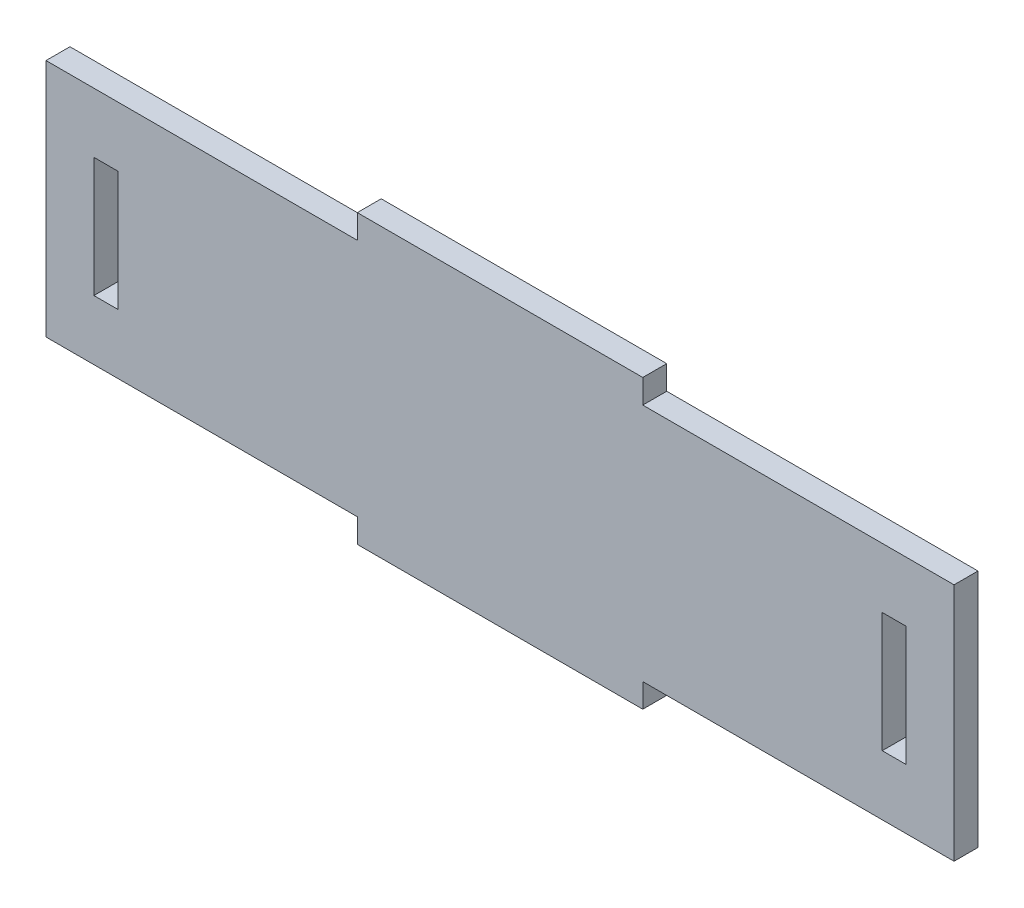
ISO-10303-21;
HEADER;
FILE_DESCRIPTION(('STEP AP214'),'2;1');
FILE_NAME('part.step','',(''),(''),'','','');
FILE_SCHEMA(('AUTOMOTIVE_DESIGN { 1 0 10303 214 1 1 1 1 }'));
ENDSEC;
DATA;
#1=APPLICATION_CONTEXT('core data for automotive mechanical design processes');
#2=APPLICATION_PROTOCOL_DEFINITION('international standard','automotive_design',2000,#1);
#3=PRODUCT_CONTEXT('',#1,'mechanical');
#4=PRODUCT('Part','Part','',(#3));
#5=PRODUCT_RELATED_PRODUCT_CATEGORY('part','',(#4));
#6=PRODUCT_DEFINITION_FORMATION('','',#4);
#7=PRODUCT_DEFINITION_CONTEXT('part definition',#1,'design');
#8=PRODUCT_DEFINITION('design','',#6,#7);
#9=PRODUCT_DEFINITION_SHAPE('','',#8);
#10=(LENGTH_UNIT() NAMED_UNIT(*) SI_UNIT(.MILLI.,.METRE.));
#11=(NAMED_UNIT(*) PLANE_ANGLE_UNIT() SI_UNIT($,.RADIAN.));
#12=(NAMED_UNIT(*) SI_UNIT($,.STERADIAN.) SOLID_ANGLE_UNIT());
#13=UNCERTAINTY_MEASURE_WITH_UNIT(LENGTH_MEASURE(1.E-05),#10,'distance_accuracy_value','');
#14=(GEOMETRIC_REPRESENTATION_CONTEXT(3) GLOBAL_UNCERTAINTY_ASSIGNED_CONTEXT((#13)) GLOBAL_UNIT_ASSIGNED_CONTEXT((#10,
#11,#12)) REPRESENTATION_CONTEXT('',''));
#15=CARTESIAN_POINT('',(0.,0.,0.));
#16=DIRECTION('',(0.,0.,1.));
#17=DIRECTION('',(1.,0.,0.));
#18=AXIS2_PLACEMENT_3D('',#15,#16,#17);
#19=CARTESIAN_POINT('',(0.,0.,2.));
#20=DIRECTION('',(0.,0.,-1.));
#21=DIRECTION('',(-1.,0.,0.));
#22=AXIS2_PLACEMENT_3D('',#19,#20,#21);
#23=PLANE('',#22);
#24=DIRECTION('',(0.,-1.,0.));
#25=VECTOR('',#24,1.);
#26=CARTESIAN_POINT('',(2.,15.,2.));
#27=LINE('',#26,#25);
#28=CARTESIAN_POINT('',(2.,15.,2.));
#29=VERTEX_POINT('',#28);
#30=CARTESIAN_POINT('',(2.,5.,2.));
#31=VERTEX_POINT('',#30);
#32=EDGE_CURVE('E225',#29,#31,#27,.T.);
#33=ORIENTED_EDGE('',*,*,#32,.F.);
#34=DIRECTION('',(-1.,0.,0.));
#35=VECTOR('',#34,1.);
#36=CARTESIAN_POINT('',(2.,15.,2.));
#37=LINE('',#36,#35);
#38=CARTESIAN_POINT('',(3.99999999999999,15.,2.));
#39=VERTEX_POINT('',#38);
#40=EDGE_CURVE('E236',#39,#29,#37,.T.);
#41=ORIENTED_EDGE('',*,*,#40,.F.);
#42=DIRECTION('',(0.,1.,0.));
#43=VECTOR('',#42,1.);
#44=CARTESIAN_POINT('',(3.99999999999999,15.,2.));
#45=LINE('',#44,#43);
#46=CARTESIAN_POINT('',(3.99999999999999,5.,2.));
#47=VERTEX_POINT('',#46);
#48=EDGE_CURVE('E232',#47,#39,#45,.T.);
#49=ORIENTED_EDGE('',*,*,#48,.F.);
#50=DIRECTION('',(1.,0.,0.));
#51=VECTOR('',#50,1.);
#52=CARTESIAN_POINT('',(2.,5.,2.));
#53=LINE('',#52,#51);
#54=EDGE_CURVE('E228',#31,#47,#53,.T.);
#55=ORIENTED_EDGE('',*,*,#54,.F.);
#56=EDGE_LOOP('',(#33,#41,#49,#55));
#57=FACE_BOUND('',#56,.T.);
#58=DIRECTION('',(1.,0.,0.));
#59=VECTOR('',#58,1.);
#60=CARTESIAN_POINT('',(-2.,0.,2.));
#61=LINE('',#60,#59);
#62=CARTESIAN_POINT('',(-2.,0.,2.));
#63=VERTEX_POINT('',#62);
#64=CARTESIAN_POINT('',(24.,0.,2.));
#65=VERTEX_POINT('',#64);
#66=EDGE_CURVE('E268',#63,#65,#61,.T.);
#67=ORIENTED_EDGE('',*,*,#66,.T.);
#68=DIRECTION('',(0.,-1.,0.));
#69=VECTOR('',#68,1.);
#70=CARTESIAN_POINT('',(24.,0.,2.));
#71=LINE('',#70,#69);
#72=CARTESIAN_POINT('',(24.,-2.,2.));
#73=VERTEX_POINT('',#72);
#74=EDGE_CURVE('E271',#65,#73,#71,.T.);
#75=ORIENTED_EDGE('',*,*,#74,.T.);
#76=DIRECTION('',(1.,0.,0.));
#77=VECTOR('',#76,1.);
#78=CARTESIAN_POINT('',(24.,-2.,2.));
#79=LINE('',#78,#77);
#80=CARTESIAN_POINT('',(47.848,-2.,2.));
#81=VERTEX_POINT('',#80);
#82=EDGE_CURVE('E275',#73,#81,#79,.T.);
#83=ORIENTED_EDGE('',*,*,#82,.T.);
#84=DIRECTION('',(0.,1.,0.));
#85=VECTOR('',#84,1.);
#86=CARTESIAN_POINT('',(47.848,-2.,2.));
#87=LINE('',#86,#85);
#88=CARTESIAN_POINT('',(47.848,0.,2.));
#89=VERTEX_POINT('',#88);
#90=EDGE_CURVE('E278',#81,#89,#87,.T.);
#91=ORIENTED_EDGE('',*,*,#90,.T.);
#92=DIRECTION('',(1.,0.,0.));
#93=VECTOR('',#92,1.);
#94=CARTESIAN_POINT('',(47.848,0.,2.));
#95=LINE('',#94,#93);
#96=CARTESIAN_POINT('',(73.848,0.,2.));
#97=VERTEX_POINT('',#96);
#98=EDGE_CURVE('E281',#89,#97,#95,.T.);
#99=ORIENTED_EDGE('',*,*,#98,.T.);
#100=DIRECTION('',(0.,1.,0.));
#101=VECTOR('',#100,1.);
#102=CARTESIAN_POINT('',(73.848,20.,2.));
#103=LINE('',#102,#101);
#104=CARTESIAN_POINT('',(73.848,20.,2.));
#105=VERTEX_POINT('',#104);
#106=EDGE_CURVE('E284',#97,#105,#103,.T.);
#107=ORIENTED_EDGE('',*,*,#106,.T.);
#108=DIRECTION('',(-1.,0.,0.));
#109=VECTOR('',#108,1.);
#110=CARTESIAN_POINT('',(71.848,20.,2.));
#111=LINE('',#110,#109);
#112=CARTESIAN_POINT('',(47.848,20.,2.));
#113=VERTEX_POINT('',#112);
#114=EDGE_CURVE('E287',#105,#113,#111,.T.);
#115=ORIENTED_EDGE('',*,*,#114,.T.);
#116=DIRECTION('',(0.,1.,0.));
#117=VECTOR('',#116,1.);
#118=CARTESIAN_POINT('',(47.848,22.,2.));
#119=LINE('',#118,#117);
#120=CARTESIAN_POINT('',(47.848,22.,2.));
#121=VERTEX_POINT('',#120);
#122=EDGE_CURVE('E290',#113,#121,#119,.T.);
#123=ORIENTED_EDGE('',*,*,#122,.T.);
#124=DIRECTION('',(-1.,0.,0.));
#125=VECTOR('',#124,1.);
#126=CARTESIAN_POINT('',(24.,22.,2.));
#127=LINE('',#126,#125);
#128=CARTESIAN_POINT('',(24.,22.,2.));
#129=VERTEX_POINT('',#128);
#130=EDGE_CURVE('E293',#121,#129,#127,.T.);
#131=ORIENTED_EDGE('',*,*,#130,.T.);
#132=DIRECTION('',(0.,-1.,0.));
#133=VECTOR('',#132,1.);
#134=CARTESIAN_POINT('',(24.,20.,2.));
#135=LINE('',#134,#133);
#136=CARTESIAN_POINT('',(24.,20.,2.));
#137=VERTEX_POINT('',#136);
#138=EDGE_CURVE('E296',#129,#137,#135,.T.);
#139=ORIENTED_EDGE('',*,*,#138,.T.);
#140=DIRECTION('',(-1.,0.,0.));
#141=VECTOR('',#140,1.);
#142=CARTESIAN_POINT('',(0.,20.,2.));
#143=LINE('',#142,#141);
#144=CARTESIAN_POINT('',(-2.,20.,2.));
#145=VERTEX_POINT('',#144);
#146=EDGE_CURVE('E299',#137,#145,#143,.T.);
#147=ORIENTED_EDGE('',*,*,#146,.T.);
#148=DIRECTION('',(0.,-1.,0.));
#149=VECTOR('',#148,1.);
#150=CARTESIAN_POINT('',(-2.,20.,2.));
#151=LINE('',#150,#149);
#152=EDGE_CURVE('E302',#145,#63,#151,.T.);
#153=ORIENTED_EDGE('',*,*,#152,.T.);
#154=EDGE_LOOP('',(#67,#75,#83,#91,#99,#107,#115,#123,#131,#139,#147,#153));
#155=FACE_BOUND('',#154,.T.);
#156=DIRECTION('',(0.,-1.,0.));
#157=VECTOR('',#156,1.);
#158=CARTESIAN_POINT('',(67.848,15.,2.));
#159=LINE('',#158,#157);
#160=CARTESIAN_POINT('',(67.848,15.,2.));
#161=VERTEX_POINT('',#160);
#162=CARTESIAN_POINT('',(67.848,5.,2.));
#163=VERTEX_POINT('',#162);
#164=EDGE_CURVE('E177',#161,#163,#159,.T.);
#165=ORIENTED_EDGE('',*,*,#164,.F.);
#166=DIRECTION('',(-1.,0.,0.));
#167=VECTOR('',#166,1.);
#168=CARTESIAN_POINT('',(67.848,15.,2.));
#169=LINE('',#168,#167);
#170=CARTESIAN_POINT('',(69.848,15.,2.));
#171=VERTEX_POINT('',#170);
#172=EDGE_CURVE('E203',#171,#161,#169,.T.);
#173=ORIENTED_EDGE('',*,*,#172,.F.);
#174=DIRECTION('',(0.,1.,0.));
#175=VECTOR('',#174,1.);
#176=CARTESIAN_POINT('',(69.848,15.,2.));
#177=LINE('',#176,#175);
#178=CARTESIAN_POINT('',(69.848,5.,2.));
#179=VERTEX_POINT('',#178);
#180=EDGE_CURVE('E199',#179,#171,#177,.T.);
#181=ORIENTED_EDGE('',*,*,#180,.F.);
#182=DIRECTION('',(1.,0.,0.));
#183=VECTOR('',#182,1.);
#184=CARTESIAN_POINT('',(67.848,5.,2.));
#185=LINE('',#184,#183);
#186=EDGE_CURVE('E186',#163,#179,#185,.T.);
#187=ORIENTED_EDGE('',*,*,#186,.F.);
#188=EDGE_LOOP('',(#165,#173,#181,#187));
#189=FACE_BOUND('',#188,.T.);
#190=ADVANCED_FACE('F39',(#57,#155,#189),#23,.F.);
#191=CARTESIAN_POINT('',(0.,0.,0.));
#192=DIRECTION('',(0.,0.,-1.));
#193=DIRECTION('',(-1.,0.,0.));
#194=AXIS2_PLACEMENT_3D('',#191,#192,#193);
#195=PLANE('',#194);
#196=DIRECTION('',(1.,0.,0.));
#197=VECTOR('',#196,1.);
#198=CARTESIAN_POINT('',(0.,0.,0.));
#199=LINE('',#198,#197);
#200=CARTESIAN_POINT('',(-2.,0.,0.));
#201=VERTEX_POINT('',#200);
#202=CARTESIAN_POINT('',(24.,0.,0.));
#203=VERTEX_POINT('',#202);
#204=EDGE_CURVE('E267',#201,#203,#199,.T.);
#205=ORIENTED_EDGE('',*,*,#204,.F.);
#206=DIRECTION('',(0.,-1.,0.));
#207=VECTOR('',#206,1.);
#208=CARTESIAN_POINT('',(-2.,20.,0.));
#209=LINE('',#208,#207);
#210=CARTESIAN_POINT('',(-2.,20.,0.));
#211=VERTEX_POINT('',#210);
#212=EDGE_CURVE('E272',#211,#201,#209,.T.);
#213=ORIENTED_EDGE('',*,*,#212,.F.);
#214=DIRECTION('',(-1.,0.,0.));
#215=VECTOR('',#214,1.);
#216=CARTESIAN_POINT('',(0.,20.,0.));
#217=LINE('',#216,#215);
#218=CARTESIAN_POINT('',(24.,20.,0.));
#219=VERTEX_POINT('',#218);
#220=EDGE_CURVE('E338',#219,#211,#217,.T.);
#221=ORIENTED_EDGE('',*,*,#220,.F.);
#222=DIRECTION('',(0.,-1.,0.));
#223=VECTOR('',#222,1.);
#224=CARTESIAN_POINT('',(24.,20.,0.));
#225=LINE('',#224,#223);
#226=CARTESIAN_POINT('',(24.,22.,0.));
#227=VERTEX_POINT('',#226);
#228=EDGE_CURVE('E334',#227,#219,#225,.T.);
#229=ORIENTED_EDGE('',*,*,#228,.F.);
#230=DIRECTION('',(-1.,0.,0.));
#231=VECTOR('',#230,1.);
#232=CARTESIAN_POINT('',(24.,22.,0.));
#233=LINE('',#232,#231);
#234=CARTESIAN_POINT('',(47.848,22.,0.));
#235=VERTEX_POINT('',#234);
#236=EDGE_CURVE('E331',#235,#227,#233,.T.);
#237=ORIENTED_EDGE('',*,*,#236,.F.);
#238=DIRECTION('',(0.,1.,0.));
#239=VECTOR('',#238,1.);
#240=CARTESIAN_POINT('',(47.848,22.,0.));
#241=LINE('',#240,#239);
#242=CARTESIAN_POINT('',(47.848,20.,0.));
#243=VERTEX_POINT('',#242);
#244=EDGE_CURVE('E328',#243,#235,#241,.T.);
#245=ORIENTED_EDGE('',*,*,#244,.F.);
#246=DIRECTION('',(-1.,0.,0.));
#247=VECTOR('',#246,1.);
#248=CARTESIAN_POINT('',(47.848,20.,0.));
#249=LINE('',#248,#247);
#250=CARTESIAN_POINT('',(73.848,20.,0.));
#251=VERTEX_POINT('',#250);
#252=EDGE_CURVE('E325',#251,#243,#249,.T.);
#253=ORIENTED_EDGE('',*,*,#252,.F.);
#254=DIRECTION('',(0.,1.,0.));
#255=VECTOR('',#254,1.);
#256=CARTESIAN_POINT('',(73.848,20.,0.));
#257=LINE('',#256,#255);
#258=CARTESIAN_POINT('',(73.848,0.,0.));
#259=VERTEX_POINT('',#258);
#260=EDGE_CURVE('E321',#259,#251,#257,.T.);
#261=ORIENTED_EDGE('',*,*,#260,.F.);
#262=DIRECTION('',(1.,0.,0.));
#263=VECTOR('',#262,1.);
#264=CARTESIAN_POINT('',(73.848,0.,0.));
#265=LINE('',#264,#263);
#266=CARTESIAN_POINT('',(47.848,0.,0.));
#267=VERTEX_POINT('',#266);
#268=EDGE_CURVE('E318',#267,#259,#265,.T.);
#269=ORIENTED_EDGE('',*,*,#268,.F.);
#270=DIRECTION('',(0.,1.,0.));
#271=VECTOR('',#270,1.);
#272=CARTESIAN_POINT('',(47.848,-2.,0.));
#273=LINE('',#272,#271);
#274=CARTESIAN_POINT('',(47.848,-2.,0.));
#275=VERTEX_POINT('',#274);
#276=EDGE_CURVE('E314',#275,#267,#273,.T.);
#277=ORIENTED_EDGE('',*,*,#276,.F.);
#278=DIRECTION('',(1.,0.,0.));
#279=VECTOR('',#278,1.);
#280=CARTESIAN_POINT('',(24.,-2.,0.));
#281=LINE('',#280,#279);
#282=CARTESIAN_POINT('',(24.,-2.,0.));
#283=VERTEX_POINT('',#282);
#284=EDGE_CURVE('E311',#283,#275,#281,.T.);
#285=ORIENTED_EDGE('',*,*,#284,.F.);
#286=DIRECTION('',(0.,-1.,0.));
#287=VECTOR('',#286,1.);
#288=CARTESIAN_POINT('',(24.,0.,0.));
#289=LINE('',#288,#287);
#290=EDGE_CURVE('E308',#203,#283,#289,.T.);
#291=ORIENTED_EDGE('',*,*,#290,.F.);
#292=EDGE_LOOP('',(#205,#213,#221,#229,#237,#245,#253,#261,#269,#277,#285,#291));
#293=FACE_BOUND('',#292,.T.);
#294=DIRECTION('',(-1.,0.,0.));
#295=VECTOR('',#294,1.);
#296=CARTESIAN_POINT('',(2.,15.,0.));
#297=LINE('',#296,#295);
#298=CARTESIAN_POINT('',(3.99999999999999,15.,0.));
#299=VERTEX_POINT('',#298);
#300=CARTESIAN_POINT('',(2.,15.,0.));
#301=VERTEX_POINT('',#300);
#302=EDGE_CURVE('E229',#299,#301,#297,.T.);
#303=ORIENTED_EDGE('',*,*,#302,.T.);
#304=DIRECTION('',(0.,-1.,0.));
#305=VECTOR('',#304,1.);
#306=CARTESIAN_POINT('',(2.,15.,0.));
#307=LINE('',#306,#305);
#308=CARTESIAN_POINT('',(2.,5.,0.));
#309=VERTEX_POINT('',#308);
#310=EDGE_CURVE('E195',#301,#309,#307,.T.);
#311=ORIENTED_EDGE('',*,*,#310,.T.);
#312=DIRECTION('',(1.,0.,0.));
#313=VECTOR('',#312,1.);
#314=CARTESIAN_POINT('',(2.,5.,0.));
#315=LINE('',#314,#313);
#316=CARTESIAN_POINT('',(3.99999999999999,5.,0.));
#317=VERTEX_POINT('',#316);
#318=EDGE_CURVE('E243',#309,#317,#315,.T.);
#319=ORIENTED_EDGE('',*,*,#318,.T.);
#320=DIRECTION('',(0.,1.,0.));
#321=VECTOR('',#320,1.);
#322=CARTESIAN_POINT('',(3.99999999999999,15.,0.));
#323=LINE('',#322,#321);
#324=EDGE_CURVE('E247',#317,#299,#323,.T.);
#325=ORIENTED_EDGE('',*,*,#324,.T.);
#326=EDGE_LOOP('',(#303,#311,#319,#325));
#327=FACE_BOUND('',#326,.T.);
#328=DIRECTION('',(-1.,0.,0.));
#329=VECTOR('',#328,1.);
#330=CARTESIAN_POINT('',(67.848,15.,0.));
#331=LINE('',#330,#329);
#332=CARTESIAN_POINT('',(69.848,15.,0.));
#333=VERTEX_POINT('',#332);
#334=CARTESIAN_POINT('',(67.848,15.,0.));
#335=VERTEX_POINT('',#334);
#336=EDGE_CURVE('E187',#333,#335,#331,.T.);
#337=ORIENTED_EDGE('',*,*,#336,.T.);
#338=DIRECTION('',(0.,-1.,0.));
#339=VECTOR('',#338,1.);
#340=CARTESIAN_POINT('',(67.848,15.,0.));
#341=LINE('',#340,#339);
#342=CARTESIAN_POINT('',(67.848,5.,0.));
#343=VERTEX_POINT('',#342);
#344=EDGE_CURVE('E63',#335,#343,#341,.T.);
#345=ORIENTED_EDGE('',*,*,#344,.T.);
#346=DIRECTION('',(1.,0.,0.));
#347=VECTOR('',#346,1.);
#348=CARTESIAN_POINT('',(67.848,5.,0.));
#349=LINE('',#348,#347);
#350=CARTESIAN_POINT('',(69.848,5.,0.));
#351=VERTEX_POINT('',#350);
#352=EDGE_CURVE('E193',#343,#351,#349,.T.);
#353=ORIENTED_EDGE('',*,*,#352,.T.);
#354=DIRECTION('',(0.,1.,0.));
#355=VECTOR('',#354,1.);
#356=CARTESIAN_POINT('',(69.848,15.,0.));
#357=LINE('',#356,#355);
#358=EDGE_CURVE('E212',#351,#333,#357,.T.);
#359=ORIENTED_EDGE('',*,*,#358,.T.);
#360=EDGE_LOOP('',(#337,#345,#353,#359));
#361=FACE_BOUND('',#360,.T.);
#362=ADVANCED_FACE('F395',(#293,#327,#361),#195,.T.);
#363=CARTESIAN_POINT('',(0.,0.,2.));
#364=DIRECTION('',(0.,1.,0.));
#365=DIRECTION('',(0.,0.,1.));
#366=AXIS2_PLACEMENT_3D('',#363,#364,#365);
#367=PLANE('',#366);
#368=ORIENTED_EDGE('',*,*,#204,.T.);
#369=DIRECTION('',(0.,0.,-1.));
#370=VECTOR('',#369,1.);
#371=CARTESIAN_POINT('',(24.,0.,2.));
#372=LINE('',#371,#370);
#373=EDGE_CURVE('E11',#65,#203,#372,.T.);
#374=ORIENTED_EDGE('',*,*,#373,.F.);
#375=ORIENTED_EDGE('',*,*,#66,.F.);
#376=DIRECTION('',(0.,0.,-1.));
#377=VECTOR('',#376,1.);
#378=CARTESIAN_POINT('',(-2.,0.,2.));
#379=LINE('',#378,#377);
#380=EDGE_CURVE('E305',#63,#201,#379,.T.);
#381=ORIENTED_EDGE('',*,*,#380,.T.);
#382=EDGE_LOOP('',(#368,#374,#375,#381));
#383=FACE_BOUND('',#382,.T.);
#384=ADVANCED_FACE('F41',(#383),#367,.F.);
#385=CARTESIAN_POINT('',(24.,0.,2.));
#386=DIRECTION('',(1.,0.,0.));
#387=DIRECTION('',(0.,0.,-1.));
#388=AXIS2_PLACEMENT_3D('',#385,#386,#387);
#389=PLANE('',#388);
#390=ORIENTED_EDGE('',*,*,#290,.T.);
#391=DIRECTION('',(0.,0.,-1.));
#392=VECTOR('',#391,1.);
#393=CARTESIAN_POINT('',(24.,-2.,2.));
#394=LINE('',#393,#392);
#395=EDGE_CURVE('E48',#73,#283,#394,.T.);
#396=ORIENTED_EDGE('',*,*,#395,.F.);
#397=ORIENTED_EDGE('',*,*,#74,.F.);
#398=ORIENTED_EDGE('',*,*,#373,.T.);
#399=EDGE_LOOP('',(#390,#396,#397,#398));
#400=FACE_BOUND('',#399,.T.);
#401=ADVANCED_FACE('F411',(#400),#389,.F.);
#402=CARTESIAN_POINT('',(24.,-2.,2.));
#403=DIRECTION('',(0.,1.,0.));
#404=DIRECTION('',(0.,0.,1.));
#405=AXIS2_PLACEMENT_3D('',#402,#403,#404);
#406=PLANE('',#405);
#407=ORIENTED_EDGE('',*,*,#284,.T.);
#408=DIRECTION('',(0.,0.,-1.));
#409=VECTOR('',#408,1.);
#410=CARTESIAN_POINT('',(47.848,-2.,2.));
#411=LINE('',#410,#409);
#412=EDGE_CURVE('E379',#81,#275,#411,.T.);
#413=ORIENTED_EDGE('',*,*,#412,.F.);
#414=ORIENTED_EDGE('',*,*,#82,.F.);
#415=ORIENTED_EDGE('',*,*,#395,.T.);
#416=EDGE_LOOP('',(#407,#413,#414,#415));
#417=FACE_BOUND('',#416,.T.);
#418=ADVANCED_FACE('F388',(#417),#406,.F.);
#419=CARTESIAN_POINT('',(47.848,-2.,2.));
#420=DIRECTION('',(-1.,0.,0.));
#421=DIRECTION('',(0.,0.,1.));
#422=AXIS2_PLACEMENT_3D('',#419,#420,#421);
#423=PLANE('',#422);
#424=ORIENTED_EDGE('',*,*,#276,.T.);
#425=DIRECTION('',(0.,0.,-1.));
#426=VECTOR('',#425,1.);
#427=CARTESIAN_POINT('',(47.848,0.,2.));
#428=LINE('',#427,#426);
#429=EDGE_CURVE('E375',#89,#267,#428,.T.);
#430=ORIENTED_EDGE('',*,*,#429,.F.);
#431=ORIENTED_EDGE('',*,*,#90,.F.);
#432=ORIENTED_EDGE('',*,*,#412,.T.);
#433=EDGE_LOOP('',(#424,#430,#431,#432));
#434=FACE_BOUND('',#433,.T.);
#435=ADVANCED_FACE('F400',(#434),#423,.F.);
#436=CARTESIAN_POINT('',(73.848,0.,2.));
#437=DIRECTION('',(0.,1.,0.));
#438=DIRECTION('',(-1.,0.,0.));
#439=AXIS2_PLACEMENT_3D('',#436,#437,#438);
#440=PLANE('',#439);
#441=ORIENTED_EDGE('',*,*,#268,.T.);
#442=DIRECTION('',(0.,0.,-1.));
#443=VECTOR('',#442,1.);
#444=CARTESIAN_POINT('',(73.848,0.,2.));
#445=LINE('',#444,#443);
#446=EDGE_CURVE('E371',#97,#259,#445,.T.);
#447=ORIENTED_EDGE('',*,*,#446,.F.);
#448=ORIENTED_EDGE('',*,*,#98,.F.);
#449=ORIENTED_EDGE('',*,*,#429,.T.);
#450=EDGE_LOOP('',(#441,#447,#448,#449));
#451=FACE_BOUND('',#450,.T.);
#452=ADVANCED_FACE('F404',(#451),#440,.F.);
#453=CARTESIAN_POINT('',(73.848,20.,2.));
#454=DIRECTION('',(-1.,0.,0.));
#455=DIRECTION('',(0.,0.,1.));
#456=AXIS2_PLACEMENT_3D('',#453,#454,#455);
#457=PLANE('',#456);
#458=ORIENTED_EDGE('',*,*,#260,.T.);
#459=DIRECTION('',(0.,0.,-1.));
#460=VECTOR('',#459,1.);
#461=CARTESIAN_POINT('',(73.848,20.,2.));
#462=LINE('',#461,#460);
#463=EDGE_CURVE('E367',#105,#251,#462,.T.);
#464=ORIENTED_EDGE('',*,*,#463,.F.);
#465=ORIENTED_EDGE('',*,*,#106,.F.);
#466=ORIENTED_EDGE('',*,*,#446,.T.);
#467=EDGE_LOOP('',(#458,#464,#465,#466));
#468=FACE_BOUND('',#467,.T.);
#469=ADVANCED_FACE('F442',(#468),#457,.F.);
#470=CARTESIAN_POINT('',(47.848,20.,2.));
#471=DIRECTION('',(0.,-1.,0.));
#472=DIRECTION('',(0.,0.,-1.));
#473=AXIS2_PLACEMENT_3D('',#470,#471,#472);
#474=PLANE('',#473);
#475=ORIENTED_EDGE('',*,*,#252,.T.);
#476=DIRECTION('',(0.,0.,-1.));
#477=VECTOR('',#476,1.);
#478=CARTESIAN_POINT('',(47.848,20.,2.));
#479=LINE('',#478,#477);
#480=EDGE_CURVE('E363',#113,#243,#479,.T.);
#481=ORIENTED_EDGE('',*,*,#480,.F.);
#482=ORIENTED_EDGE('',*,*,#114,.F.);
#483=ORIENTED_EDGE('',*,*,#463,.T.);
#484=EDGE_LOOP('',(#475,#481,#482,#483));
#485=FACE_BOUND('',#484,.T.);
#486=ADVANCED_FACE('F440',(#485),#474,.F.);
#487=CARTESIAN_POINT('',(47.848,22.,2.));
#488=DIRECTION('',(-1.,0.,0.));
#489=DIRECTION('',(0.,0.,1.));
#490=AXIS2_PLACEMENT_3D('',#487,#488,#489);
#491=PLANE('',#490);
#492=ORIENTED_EDGE('',*,*,#244,.T.);
#493=DIRECTION('',(0.,0.,-1.));
#494=VECTOR('',#493,1.);
#495=CARTESIAN_POINT('',(47.848,22.,2.));
#496=LINE('',#495,#494);
#497=EDGE_CURVE('E359',#121,#235,#496,.T.);
#498=ORIENTED_EDGE('',*,*,#497,.F.);
#499=ORIENTED_EDGE('',*,*,#122,.F.);
#500=ORIENTED_EDGE('',*,*,#480,.T.);
#501=EDGE_LOOP('',(#492,#498,#499,#500));
#502=FACE_BOUND('',#501,.T.);
#503=ADVANCED_FACE('F435',(#502),#491,.F.);
#504=CARTESIAN_POINT('',(24.,22.,2.));
#505=DIRECTION('',(0.,-1.,0.));
#506=DIRECTION('',(0.,0.,-1.));
#507=AXIS2_PLACEMENT_3D('',#504,#505,#506);
#508=PLANE('',#507);
#509=ORIENTED_EDGE('',*,*,#236,.T.);
#510=DIRECTION('',(0.,0.,-1.));
#511=VECTOR('',#510,1.);
#512=CARTESIAN_POINT('',(24.,22.,2.));
#513=LINE('',#512,#511);
#514=EDGE_CURVE('E355',#129,#227,#513,.T.);
#515=ORIENTED_EDGE('',*,*,#514,.F.);
#516=ORIENTED_EDGE('',*,*,#130,.F.);
#517=ORIENTED_EDGE('',*,*,#497,.T.);
#518=EDGE_LOOP('',(#509,#515,#516,#517));
#519=FACE_BOUND('',#518,.T.);
#520=ADVANCED_FACE('F431',(#519),#508,.F.);
#521=CARTESIAN_POINT('',(24.,20.,2.));
#522=DIRECTION('',(1.,0.,0.));
#523=DIRECTION('',(0.,0.,-1.));
#524=AXIS2_PLACEMENT_3D('',#521,#522,#523);
#525=PLANE('',#524);
#526=ORIENTED_EDGE('',*,*,#228,.T.);
#527=DIRECTION('',(0.,0.,-1.));
#528=VECTOR('',#527,1.);
#529=CARTESIAN_POINT('',(24.,20.,2.));
#530=LINE('',#529,#528);
#531=EDGE_CURVE('E351',#137,#219,#530,.T.);
#532=ORIENTED_EDGE('',*,*,#531,.F.);
#533=ORIENTED_EDGE('',*,*,#138,.F.);
#534=ORIENTED_EDGE('',*,*,#514,.T.);
#535=EDGE_LOOP('',(#526,#532,#533,#534));
#536=FACE_BOUND('',#535,.T.);
#537=ADVANCED_FACE('F426',(#536),#525,.F.);
#538=CARTESIAN_POINT('',(0.,20.,2.));
#539=DIRECTION('',(0.,-1.,0.));
#540=DIRECTION('',(0.,0.,-1.));
#541=AXIS2_PLACEMENT_3D('',#538,#539,#540);
#542=PLANE('',#541);
#543=ORIENTED_EDGE('',*,*,#220,.T.);
#544=DIRECTION('',(0.,0.,-1.));
#545=VECTOR('',#544,1.);
#546=CARTESIAN_POINT('',(-2.,20.,2.));
#547=LINE('',#546,#545);
#548=EDGE_CURVE('E347',#145,#211,#547,.T.);
#549=ORIENTED_EDGE('',*,*,#548,.F.);
#550=ORIENTED_EDGE('',*,*,#146,.F.);
#551=ORIENTED_EDGE('',*,*,#531,.T.);
#552=EDGE_LOOP('',(#543,#549,#550,#551));
#553=FACE_BOUND('',#552,.T.);
#554=ADVANCED_FACE('F421',(#553),#542,.F.);
#555=CARTESIAN_POINT('',(-2.,20.,2.));
#556=DIRECTION('',(1.,0.,0.));
#557=DIRECTION('',(0.,1.,0.));
#558=AXIS2_PLACEMENT_3D('',#555,#556,#557);
#559=PLANE('',#558);
#560=ORIENTED_EDGE('',*,*,#212,.T.);
#561=ORIENTED_EDGE('',*,*,#380,.F.);
#562=ORIENTED_EDGE('',*,*,#152,.F.);
#563=ORIENTED_EDGE('',*,*,#548,.T.);
#564=EDGE_LOOP('',(#560,#561,#562,#563));
#565=FACE_BOUND('',#564,.T.);
#566=ADVANCED_FACE('F416',(#565),#559,.F.);
#567=CARTESIAN_POINT('',(2.,15.,2.));
#568=DIRECTION('',(1.,0.,0.));
#569=DIRECTION('',(0.,1.,0.));
#570=AXIS2_PLACEMENT_3D('',#567,#568,#569);
#571=PLANE('',#570);
#572=ORIENTED_EDGE('',*,*,#310,.F.);
#573=DIRECTION('',(0.,0.,-1.));
#574=VECTOR('',#573,1.);
#575=CARTESIAN_POINT('',(2.,15.,2.));
#576=LINE('',#575,#574);
#577=EDGE_CURVE('E239',#29,#301,#576,.T.);
#578=ORIENTED_EDGE('',*,*,#577,.F.);
#579=ORIENTED_EDGE('',*,*,#32,.T.);
#580=DIRECTION('',(0.,0.,-1.));
#581=VECTOR('',#580,1.);
#582=CARTESIAN_POINT('',(2.,5.,2.));
#583=LINE('',#582,#581);
#584=EDGE_CURVE('E263',#31,#309,#583,.T.);
#585=ORIENTED_EDGE('',*,*,#584,.T.);
#586=EDGE_LOOP('',(#572,#578,#579,#585));
#587=FACE_BOUND('',#586,.T.);
#588=ADVANCED_FACE('F460',(#587),#571,.T.);
#589=CARTESIAN_POINT('',(2.,5.,2.));
#590=DIRECTION('',(0.,1.,0.));
#591=DIRECTION('',(0.,0.,1.));
#592=AXIS2_PLACEMENT_3D('',#589,#590,#591);
#593=PLANE('',#592);
#594=ORIENTED_EDGE('',*,*,#318,.F.);
#595=ORIENTED_EDGE('',*,*,#584,.F.);
#596=ORIENTED_EDGE('',*,*,#54,.T.);
#597=DIRECTION('',(0.,0.,-1.));
#598=VECTOR('',#597,1.);
#599=CARTESIAN_POINT('',(3.99999999999999,5.,2.));
#600=LINE('',#599,#598);
#601=EDGE_CURVE('E260',#47,#317,#600,.T.);
#602=ORIENTED_EDGE('',*,*,#601,.T.);
#603=EDGE_LOOP('',(#594,#595,#596,#602));
#604=FACE_BOUND('',#603,.T.);
#605=ADVANCED_FACE('F498',(#604),#593,.T.);
#606=CARTESIAN_POINT('',(3.99999999999999,15.,2.));
#607=DIRECTION('',(-1.,0.,0.));
#608=DIRECTION('',(0.,0.,1.));
#609=AXIS2_PLACEMENT_3D('',#606,#607,#608);
#610=PLANE('',#609);
#611=ORIENTED_EDGE('',*,*,#324,.F.);
#612=ORIENTED_EDGE('',*,*,#601,.F.);
#613=ORIENTED_EDGE('',*,*,#48,.T.);
#614=DIRECTION('',(0.,0.,-1.));
#615=VECTOR('',#614,1.);
#616=CARTESIAN_POINT('',(3.99999999999999,15.,2.));
#617=LINE('',#616,#615);
#618=EDGE_CURVE('E257',#39,#299,#617,.T.);
#619=ORIENTED_EDGE('',*,*,#618,.T.);
#620=EDGE_LOOP('',(#611,#612,#613,#619));
#621=FACE_BOUND('',#620,.T.);
#622=ADVANCED_FACE('F505',(#621),#610,.T.);
#623=CARTESIAN_POINT('',(2.,15.,2.));
#624=DIRECTION('',(0.,-1.,0.));
#625=DIRECTION('',(0.,0.,-1.));
#626=AXIS2_PLACEMENT_3D('',#623,#624,#625);
#627=PLANE('',#626);
#628=ORIENTED_EDGE('',*,*,#302,.F.);
#629=ORIENTED_EDGE('',*,*,#618,.F.);
#630=ORIENTED_EDGE('',*,*,#40,.T.);
#631=ORIENTED_EDGE('',*,*,#577,.T.);
#632=EDGE_LOOP('',(#628,#629,#630,#631));
#633=FACE_BOUND('',#632,.T.);
#634=ADVANCED_FACE('F512',(#633),#627,.T.);
#635=CARTESIAN_POINT('',(67.848,15.,2.));
#636=DIRECTION('',(1.,0.,0.));
#637=DIRECTION('',(0.,0.,-1.));
#638=AXIS2_PLACEMENT_3D('',#635,#636,#637);
#639=PLANE('',#638);
#640=ORIENTED_EDGE('',*,*,#344,.F.);
#641=DIRECTION('',(0.,0.,-1.));
#642=VECTOR('',#641,1.);
#643=CARTESIAN_POINT('',(67.848,15.,2.));
#644=LINE('',#643,#642);
#645=EDGE_CURVE('E181',#161,#335,#644,.T.);
#646=ORIENTED_EDGE('',*,*,#645,.F.);
#647=ORIENTED_EDGE('',*,*,#164,.T.);
#648=DIRECTION('',(0.,0.,-1.));
#649=VECTOR('',#648,1.);
#650=CARTESIAN_POINT('',(67.848,5.,2.));
#651=LINE('',#650,#649);
#652=EDGE_CURVE('E180',#163,#343,#651,.T.);
#653=ORIENTED_EDGE('',*,*,#652,.T.);
#654=EDGE_LOOP('',(#640,#646,#647,#653));
#655=FACE_BOUND('',#654,.T.);
#656=ADVANCED_FACE('F179',(#655),#639,.T.);
#657=CARTESIAN_POINT('',(67.848,5.,2.));
#658=DIRECTION('',(0.,1.,0.));
#659=DIRECTION('',(0.,0.,1.));
#660=AXIS2_PLACEMENT_3D('',#657,#658,#659);
#661=PLANE('',#660);
#662=ORIENTED_EDGE('',*,*,#352,.F.);
#663=ORIENTED_EDGE('',*,*,#652,.F.);
#664=ORIENTED_EDGE('',*,*,#186,.T.);
#665=DIRECTION('',(0.,0.,-1.));
#666=VECTOR('',#665,1.);
#667=CARTESIAN_POINT('',(69.848,5.,2.));
#668=LINE('',#667,#666);
#669=EDGE_CURVE('E196',#179,#351,#668,.T.);
#670=ORIENTED_EDGE('',*,*,#669,.T.);
#671=EDGE_LOOP('',(#662,#663,#664,#670));
#672=FACE_BOUND('',#671,.T.);
#673=ADVANCED_FACE('F190',(#672),#661,.T.);
#674=CARTESIAN_POINT('',(69.848,15.,2.));
#675=DIRECTION('',(-1.,0.,0.));
#676=DIRECTION('',(0.,0.,1.));
#677=AXIS2_PLACEMENT_3D('',#674,#675,#676);
#678=PLANE('',#677);
#679=ORIENTED_EDGE('',*,*,#358,.F.);
#680=ORIENTED_EDGE('',*,*,#669,.F.);
#681=ORIENTED_EDGE('',*,*,#180,.T.);
#682=DIRECTION('',(0.,0.,-1.));
#683=VECTOR('',#682,1.);
#684=CARTESIAN_POINT('',(69.848,15.,2.));
#685=LINE('',#684,#683);
#686=EDGE_CURVE('E55',#171,#333,#685,.T.);
#687=ORIENTED_EDGE('',*,*,#686,.T.);
#688=EDGE_LOOP('',(#679,#680,#681,#687));
#689=FACE_BOUND('',#688,.T.);
#690=ADVANCED_FACE('F533',(#689),#678,.T.);
#691=CARTESIAN_POINT('',(67.848,15.,2.));
#692=DIRECTION('',(0.,-1.,0.));
#693=DIRECTION('',(0.,0.,-1.));
#694=AXIS2_PLACEMENT_3D('',#691,#692,#693);
#695=PLANE('',#694);
#696=ORIENTED_EDGE('',*,*,#336,.F.);
#697=ORIENTED_EDGE('',*,*,#686,.F.);
#698=ORIENTED_EDGE('',*,*,#172,.T.);
#699=ORIENTED_EDGE('',*,*,#645,.T.);
#700=EDGE_LOOP('',(#696,#697,#698,#699));
#701=FACE_BOUND('',#700,.T.);
#702=ADVANCED_FACE('F540',(#701),#695,.T.);
#703=CLOSED_SHELL('',(#190,#362,#384,#401,#418,#435,#452,#469,#486,#503,#520,#537,#554,#566,
#588,#605,#622,#634,#656,#673,#690,#702));
#704=MANIFOLD_SOLID_BREP('B2',#703);
#705=ADVANCED_BREP_SHAPE_REPRESENTATION('',(#18,#704),#14);
#706=SHAPE_DEFINITION_REPRESENTATION(#9,#705);
ENDSEC;
END-ISO-10303-21;
